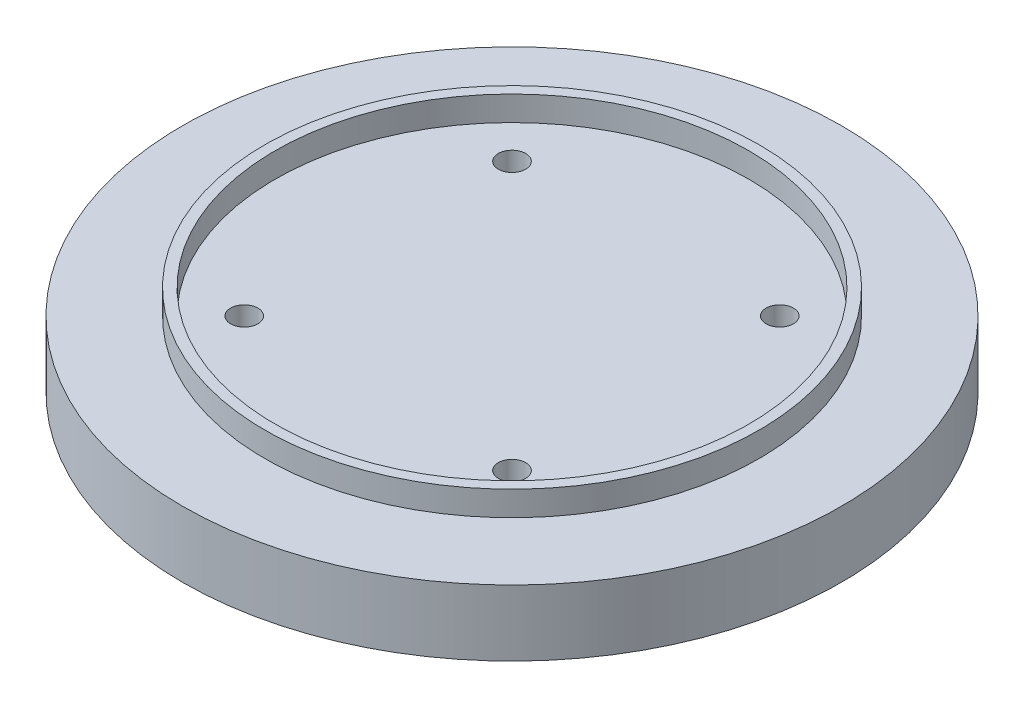
ISO-10303-21;
HEADER;
FILE_DESCRIPTION(('STEP AP214'),'2;1');
FILE_NAME('part.step','',(''),(''),'','','');
FILE_SCHEMA(('AUTOMOTIVE_DESIGN { 1 0 10303 214 1 1 1 1 }'));
ENDSEC;
DATA;
#1=APPLICATION_CONTEXT('core data for automotive mechanical design processes');
#2=APPLICATION_PROTOCOL_DEFINITION('international standard','automotive_design',2000,#1);
#3=PRODUCT_CONTEXT('',#1,'mechanical');
#4=PRODUCT('Part','Part','',(#3));
#5=PRODUCT_RELATED_PRODUCT_CATEGORY('part','',(#4));
#6=PRODUCT_DEFINITION_FORMATION('','',#4);
#7=PRODUCT_DEFINITION_CONTEXT('part definition',#1,'design');
#8=PRODUCT_DEFINITION('design','',#6,#7);
#9=PRODUCT_DEFINITION_SHAPE('','',#8);
#10=(LENGTH_UNIT() NAMED_UNIT(*) SI_UNIT(.MILLI.,.METRE.));
#11=(NAMED_UNIT(*) PLANE_ANGLE_UNIT() SI_UNIT($,.RADIAN.));
#12=(NAMED_UNIT(*) SI_UNIT($,.STERADIAN.) SOLID_ANGLE_UNIT());
#13=UNCERTAINTY_MEASURE_WITH_UNIT(LENGTH_MEASURE(1.E-05),#10,'distance_accuracy_value','');
#14=(GEOMETRIC_REPRESENTATION_CONTEXT(3) GLOBAL_UNCERTAINTY_ASSIGNED_CONTEXT((#13)) GLOBAL_UNIT_ASSIGNED_CONTEXT((#10,
#11,#12)) REPRESENTATION_CONTEXT('',''));
#15=CARTESIAN_POINT('',(0.,0.,0.));
#16=DIRECTION('',(0.,0.,1.));
#17=DIRECTION('',(1.,0.,0.));
#18=AXIS2_PLACEMENT_3D('',#15,#16,#17);
#19=CARTESIAN_POINT('',(0.,10.16,0.));
#20=DIRECTION('',(0.,1.,0.));
#21=DIRECTION('',(0.,0.,1.));
#22=AXIS2_PLACEMENT_3D('',#19,#20,#21);
#23=PLANE('',#22);
#24=CARTESIAN_POINT('',(0.,10.16,0.));
#25=DIRECTION('',(0.,1.,0.));
#26=DIRECTION('',(0.,0.,1.));
#27=AXIS2_PLACEMENT_3D('',#24,#25,#26);
#28=CIRCLE('',#27,101.6);
#29=CARTESIAN_POINT('',(0.,10.16,101.6));
#30=VERTEX_POINT('',#29);
#31=EDGE_CURVE('E49',#30,#30,#28,.T.);
#32=ORIENTED_EDGE('',*,*,#31,.T.);
#33=EDGE_LOOP('',(#32));
#34=FACE_BOUND('',#33,.T.);
#35=CARTESIAN_POINT('',(0.,10.16,0.));
#36=DIRECTION('',(0.,1.,0.));
#37=DIRECTION('',(0.,0.,1.));
#38=AXIS2_PLACEMENT_3D('',#35,#36,#37);
#39=CIRCLE('',#38,76.2);
#40=CARTESIAN_POINT('',(0.,10.16,-76.2));
#41=VERTEX_POINT('',#40);
#42=EDGE_CURVE('E461',#41,#41,#39,.T.);
#43=ORIENTED_EDGE('',*,*,#42,.F.);
#44=EDGE_LOOP('',(#43));
#45=FACE_BOUND('',#44,.T.);
#46=ADVANCED_FACE('F40',(#34,#45),#23,.T.);
#47=CARTESIAN_POINT('',(0.,10.16,0.));
#48=DIRECTION('',(0.,-1.,0.));
#49=DIRECTION('',(0.,0.,-1.));
#50=AXIS2_PLACEMENT_3D('',#47,#48,#49);
#51=CYLINDRICAL_SURFACE('',#50,101.6);
#52=ORIENTED_EDGE('',*,*,#31,.F.);
#53=EDGE_LOOP('',(#52));
#54=FACE_BOUND('',#53,.T.);
#55=CARTESIAN_POINT('',(0.,-10.16,0.));
#56=DIRECTION('',(0.,1.,0.));
#57=DIRECTION('',(0.,0.,1.));
#58=AXIS2_PLACEMENT_3D('',#55,#56,#57);
#59=CIRCLE('',#58,101.6);
#60=CARTESIAN_POINT('',(0.,-10.16,101.6));
#61=VERTEX_POINT('',#60);
#62=EDGE_CURVE('E149',#61,#61,#59,.T.);
#63=ORIENTED_EDGE('',*,*,#62,.T.);
#64=EDGE_LOOP('',(#63));
#65=FACE_BOUND('',#64,.T.);
#66=ADVANCED_FACE('F42',(#54,#65),#51,.T.);
#67=CARTESIAN_POINT('',(0.,-10.16,0.));
#68=DIRECTION('',(0.,1.,0.));
#69=DIRECTION('',(0.,0.,1.));
#70=AXIS2_PLACEMENT_3D('',#67,#68,#69);
#71=PLANE('',#70);
#72=CARTESIAN_POINT('',(-50.8,-10.16,50.8));
#73=DIRECTION('',(0.,-1.,0.));
#74=DIRECTION('',(0.,0.,-1.));
#75=AXIS2_PLACEMENT_3D('',#72,#73,#74);
#76=CIRCLE('',#75,4.2164);
#77=CARTESIAN_POINT('',(-50.8,-10.16,46.5836));
#78=VERTEX_POINT('',#77);
#79=EDGE_CURVE('E86',#78,#78,#76,.T.);
#80=ORIENTED_EDGE('',*,*,#79,.F.);
#81=EDGE_LOOP('',(#80));
#82=FACE_BOUND('',#81,.T.);
#83=CARTESIAN_POINT('',(50.8,-10.16,50.8));
#84=DIRECTION('',(0.,-1.,0.));
#85=DIRECTION('',(0.,0.,-1.));
#86=AXIS2_PLACEMENT_3D('',#83,#84,#85);
#87=CIRCLE('',#86,4.2164);
#88=CARTESIAN_POINT('',(50.8,-10.16,46.5836));
#89=VERTEX_POINT('',#88);
#90=EDGE_CURVE('E85',#89,#89,#87,.T.);
#91=ORIENTED_EDGE('',*,*,#90,.F.);
#92=EDGE_LOOP('',(#91));
#93=FACE_BOUND('',#92,.T.);
#94=CARTESIAN_POINT('',(50.8,-10.16,-50.8));
#95=DIRECTION('',(0.,-1.,0.));
#96=DIRECTION('',(0.,0.,-1.));
#97=AXIS2_PLACEMENT_3D('',#94,#95,#96);
#98=CIRCLE('',#97,4.2164);
#99=CARTESIAN_POINT('',(50.8,-10.16,-55.0164));
#100=VERTEX_POINT('',#99);
#101=EDGE_CURVE('E103',#100,#100,#98,.T.);
#102=ORIENTED_EDGE('',*,*,#101,.F.);
#103=EDGE_LOOP('',(#102));
#104=FACE_BOUND('',#103,.T.);
#105=CARTESIAN_POINT('',(-50.8,-10.16,-50.8));
#106=DIRECTION('',(0.,-1.,0.));
#107=DIRECTION('',(0.,0.,-1.));
#108=AXIS2_PLACEMENT_3D('',#105,#106,#107);
#109=CIRCLE('',#108,4.2164);
#110=CARTESIAN_POINT('',(-50.8,-10.16,-55.0164));
#111=VERTEX_POINT('',#110);
#112=EDGE_CURVE('E111',#111,#111,#109,.T.);
#113=ORIENTED_EDGE('',*,*,#112,.F.);
#114=EDGE_LOOP('',(#113));
#115=FACE_BOUND('',#114,.T.);
#116=ORIENTED_EDGE('',*,*,#62,.F.);
#117=EDGE_LOOP('',(#116));
#118=FACE_BOUND('',#117,.T.);
#119=ADVANCED_FACE('F157',(#82,#93,#104,#115,#118),#71,.F.);
#120=CARTESIAN_POINT('',(-50.8,4.064,-50.8));
#121=DIRECTION('',(0.,-1.,0.));
#122=DIRECTION('',(0.,0.,-1.));
#123=AXIS2_PLACEMENT_3D('',#120,#121,#122);
#124=CONICAL_SURFACE('',#123,4.21639999999999,1.02974425867665);
#125=CARTESIAN_POINT('',(-50.8,6.59746871406781,-50.8));
#126=VERTEX_POINT('',#125);
#127=VERTEX_LOOP('',#126);
#128=FACE_BOUND('',#127,.T.);
#129=CARTESIAN_POINT('',(-50.8,4.064,-50.8));
#130=DIRECTION('',(0.,-1.,0.));
#131=DIRECTION('',(0.,0.,-1.));
#132=AXIS2_PLACEMENT_3D('',#129,#130,#131);
#133=CIRCLE('',#132,4.21639999999999);
#134=CARTESIAN_POINT('',(-50.8,4.064,-55.0164));
#135=VERTEX_POINT('',#134);
#136=EDGE_CURVE('E115',#135,#135,#133,.T.);
#137=ORIENTED_EDGE('',*,*,#136,.T.);
#138=EDGE_LOOP('',(#137));
#139=FACE_BOUND('',#138,.T.);
#140=ADVANCED_FACE('F159',(#128,#139),#124,.F.);
#141=CARTESIAN_POINT('',(-50.8,-10.16,-50.8));
#142=DIRECTION('',(0.,-1.,0.));
#143=DIRECTION('',(0.,0.,-1.));
#144=AXIS2_PLACEMENT_3D('',#141,#142,#143);
#145=CYLINDRICAL_SURFACE('',#144,4.2164);
#146=ORIENTED_EDGE('',*,*,#136,.F.);
#147=EDGE_LOOP('',(#146));
#148=FACE_BOUND('',#147,.T.);
#149=ORIENTED_EDGE('',*,*,#112,.T.);
#150=EDGE_LOOP('',(#149));
#151=FACE_BOUND('',#150,.T.);
#152=ADVANCED_FACE('F165',(#148,#151),#145,.F.);
#153=CARTESIAN_POINT('',(50.8,4.064,-50.8));
#154=DIRECTION('',(0.,-1.,0.));
#155=DIRECTION('',(0.,0.,-1.));
#156=AXIS2_PLACEMENT_3D('',#153,#154,#155);
#157=CONICAL_SURFACE('',#156,4.21639999999999,1.02974425867665);
#158=CARTESIAN_POINT('',(50.8,6.59746871406781,-50.8));
#159=VERTEX_POINT('',#158);
#160=VERTEX_LOOP('',#159);
#161=FACE_BOUND('',#160,.T.);
#162=CARTESIAN_POINT('',(50.8,4.064,-50.8));
#163=DIRECTION('',(0.,-1.,0.));
#164=DIRECTION('',(0.,0.,-1.));
#165=AXIS2_PLACEMENT_3D('',#162,#163,#164);
#166=CIRCLE('',#165,4.21639999999999);
#167=CARTESIAN_POINT('',(50.8,4.064,-55.0164));
#168=VERTEX_POINT('',#167);
#169=EDGE_CURVE('E107',#168,#168,#166,.T.);
#170=ORIENTED_EDGE('',*,*,#169,.T.);
#171=EDGE_LOOP('',(#170));
#172=FACE_BOUND('',#171,.T.);
#173=ADVANCED_FACE('F251',(#161,#172),#157,.F.);
#174=CARTESIAN_POINT('',(50.8,-10.16,-50.8));
#175=DIRECTION('',(0.,-1.,0.));
#176=DIRECTION('',(0.,0.,-1.));
#177=AXIS2_PLACEMENT_3D('',#174,#175,#176);
#178=CYLINDRICAL_SURFACE('',#177,4.2164);
#179=ORIENTED_EDGE('',*,*,#169,.F.);
#180=EDGE_LOOP('',(#179));
#181=FACE_BOUND('',#180,.T.);
#182=ORIENTED_EDGE('',*,*,#101,.T.);
#183=EDGE_LOOP('',(#182));
#184=FACE_BOUND('',#183,.T.);
#185=ADVANCED_FACE('F247',(#181,#184),#178,.F.);
#186=CARTESIAN_POINT('',(50.8,4.064,50.8));
#187=DIRECTION('',(0.,-1.,0.));
#188=DIRECTION('',(0.,0.,-1.));
#189=AXIS2_PLACEMENT_3D('',#186,#187,#188);
#190=CONICAL_SURFACE('',#189,4.21639999999999,1.02974425867665);
#191=CARTESIAN_POINT('',(50.8,6.59746871406781,50.8));
#192=VERTEX_POINT('',#191);
#193=VERTEX_LOOP('',#192);
#194=FACE_BOUND('',#193,.T.);
#195=CARTESIAN_POINT('',(50.8,4.064,50.8));
#196=DIRECTION('',(0.,-1.,0.));
#197=DIRECTION('',(0.,0.,-1.));
#198=AXIS2_PLACEMENT_3D('',#195,#196,#197);
#199=CIRCLE('',#198,4.21639999999999);
#200=CARTESIAN_POINT('',(50.8,4.064,46.5836));
#201=VERTEX_POINT('',#200);
#202=EDGE_CURVE('E92',#201,#201,#199,.T.);
#203=ORIENTED_EDGE('',*,*,#202,.T.);
#204=EDGE_LOOP('',(#203));
#205=FACE_BOUND('',#204,.T.);
#206=ADVANCED_FACE('F243',(#194,#205),#190,.F.);
#207=CARTESIAN_POINT('',(50.8,-10.16,50.8));
#208=DIRECTION('',(0.,-1.,0.));
#209=DIRECTION('',(0.,0.,-1.));
#210=AXIS2_PLACEMENT_3D('',#207,#208,#209);
#211=CYLINDRICAL_SURFACE('',#210,4.2164);
#212=ORIENTED_EDGE('',*,*,#202,.F.);
#213=EDGE_LOOP('',(#212));
#214=FACE_BOUND('',#213,.T.);
#215=ORIENTED_EDGE('',*,*,#90,.T.);
#216=EDGE_LOOP('',(#215));
#217=FACE_BOUND('',#216,.T.);
#218=ADVANCED_FACE('F78',(#214,#217),#211,.F.);
#219=CARTESIAN_POINT('',(-50.8,4.064,50.8));
#220=DIRECTION('',(0.,-1.,0.));
#221=DIRECTION('',(0.,0.,-1.));
#222=AXIS2_PLACEMENT_3D('',#219,#220,#221);
#223=CONICAL_SURFACE('',#222,4.21639999999999,1.02974425867665);
#224=CARTESIAN_POINT('',(-50.8,6.59746871406781,50.8));
#225=VERTEX_POINT('',#224);
#226=VERTEX_LOOP('',#225);
#227=FACE_BOUND('',#226,.T.);
#228=CARTESIAN_POINT('',(-50.8,4.064,50.8));
#229=DIRECTION('',(0.,-1.,0.));
#230=DIRECTION('',(0.,0.,-1.));
#231=AXIS2_PLACEMENT_3D('',#228,#229,#230);
#232=CIRCLE('',#231,4.21639999999999);
#233=CARTESIAN_POINT('',(-50.8,4.064,46.5836));
#234=VERTEX_POINT('',#233);
#235=EDGE_CURVE('E82',#234,#234,#232,.T.);
#236=ORIENTED_EDGE('',*,*,#235,.T.);
#237=EDGE_LOOP('',(#236));
#238=FACE_BOUND('',#237,.T.);
#239=ADVANCED_FACE('F74',(#227,#238),#223,.F.);
#240=CARTESIAN_POINT('',(-50.8,-10.16,50.8));
#241=DIRECTION('',(0.,-1.,0.));
#242=DIRECTION('',(0.,0.,-1.));
#243=AXIS2_PLACEMENT_3D('',#240,#241,#242);
#244=CYLINDRICAL_SURFACE('',#243,4.2164);
#245=ORIENTED_EDGE('',*,*,#235,.F.);
#246=EDGE_LOOP('',(#245));
#247=FACE_BOUND('',#246,.T.);
#248=ORIENTED_EDGE('',*,*,#79,.T.);
#249=EDGE_LOOP('',(#248));
#250=FACE_BOUND('',#249,.T.);
#251=ADVANCED_FACE('F77',(#247,#250),#244,.F.);
#252=CARTESIAN_POINT('',(0.,17.78,0.));
#253=DIRECTION('',(0.,1.,0.));
#254=DIRECTION('',(0.,0.,1.));
#255=AXIS2_PLACEMENT_3D('',#252,#253,#254);
#256=PLANE('',#255);
#257=CARTESIAN_POINT('',(0.,17.78,0.));
#258=DIRECTION('',(0.,1.,0.));
#259=DIRECTION('',(0.,0.,1.));
#260=AXIS2_PLACEMENT_3D('',#257,#258,#259);
#261=CIRCLE('',#260,76.2);
#262=CARTESIAN_POINT('',(0.,17.78,-76.2));
#263=VERTEX_POINT('',#262);
#264=EDGE_CURVE('E96',#263,#263,#261,.T.);
#265=ORIENTED_EDGE('',*,*,#264,.T.);
#266=EDGE_LOOP('',(#265));
#267=FACE_BOUND('',#266,.T.);
#268=CARTESIAN_POINT('',(0.,17.78,0.));
#269=DIRECTION('',(0.,1.,0.));
#270=DIRECTION('',(0.,0.,1.));
#271=AXIS2_PLACEMENT_3D('',#268,#269,#270);
#272=CIRCLE('',#271,73.025);
#273=CARTESIAN_POINT('',(0.,17.78,-73.025));
#274=VERTEX_POINT('',#273);
#275=EDGE_CURVE('E459',#274,#274,#272,.T.);
#276=ORIENTED_EDGE('',*,*,#275,.F.);
#277=EDGE_LOOP('',(#276));
#278=FACE_BOUND('',#277,.T.);
#279=ADVANCED_FACE('F230',(#267,#278),#256,.T.);
#280=CARTESIAN_POINT('',(0.,17.78,0.));
#281=DIRECTION('',(0.,-1.,0.));
#282=DIRECTION('',(0.,0.,-1.));
#283=AXIS2_PLACEMENT_3D('',#280,#281,#282);
#284=CYLINDRICAL_SURFACE('',#283,76.2);
#285=CARTESIAN_POINT('',(0.,17.78,-76.2));
#286=CARTESIAN_POINT('',(0.,17.700625,-76.2));
#287=CARTESIAN_POINT('',(0.,17.62125,-76.2));
#288=CARTESIAN_POINT('',(0.,17.4625,-76.2));
#289=CARTESIAN_POINT('',(0.,17.383125,-76.2));
#290=CARTESIAN_POINT('',(0.,17.224375,-76.2));
#291=CARTESIAN_POINT('',(0.,17.145,-76.2));
#292=CARTESIAN_POINT('',(0.,16.98625,-76.2));
#293=CARTESIAN_POINT('',(0.,16.906875,-76.2));
#294=CARTESIAN_POINT('',(0.,16.748125,-76.2));
#295=CARTESIAN_POINT('',(0.,16.66875,-76.2));
#296=CARTESIAN_POINT('',(0.,16.51,-76.2));
#297=CARTESIAN_POINT('',(0.,16.430625,-76.2));
#298=CARTESIAN_POINT('',(0.,16.271875,-76.2));
#299=CARTESIAN_POINT('',(0.,16.1925,-76.2));
#300=CARTESIAN_POINT('',(0.,16.03375,-76.2));
#301=CARTESIAN_POINT('',(0.,15.954375,-76.2));
#302=CARTESIAN_POINT('',(0.,15.795625,-76.2));
#303=CARTESIAN_POINT('',(0.,15.71625,-76.2));
#304=CARTESIAN_POINT('',(0.,15.5575,-76.2));
#305=CARTESIAN_POINT('',(0.,15.478125,-76.2));
#306=CARTESIAN_POINT('',(0.,15.319375,-76.2));
#307=CARTESIAN_POINT('',(0.,15.24,-76.2));
#308=CARTESIAN_POINT('',(0.,15.08125,-76.2));
#309=CARTESIAN_POINT('',(0.,15.001875,-76.2));
#310=CARTESIAN_POINT('',(0.,14.843125,-76.2));
#311=CARTESIAN_POINT('',(0.,14.76375,-76.2));
#312=CARTESIAN_POINT('',(0.,14.605,-76.2));
#313=CARTESIAN_POINT('',(0.,14.525625,-76.2));
#314=CARTESIAN_POINT('',(0.,14.366875,-76.2));
#315=CARTESIAN_POINT('',(0.,14.2875,-76.2));
#316=CARTESIAN_POINT('',(0.,14.12875,-76.2));
#317=CARTESIAN_POINT('',(0.,14.049375,-76.2));
#318=CARTESIAN_POINT('',(0.,13.890625,-76.2));
#319=CARTESIAN_POINT('',(0.,13.81125,-76.2));
#320=CARTESIAN_POINT('',(0.,13.6525,-76.2));
#321=CARTESIAN_POINT('',(0.,13.573125,-76.2));
#322=CARTESIAN_POINT('',(0.,13.414375,-76.2));
#323=CARTESIAN_POINT('',(0.,13.335,-76.2));
#324=CARTESIAN_POINT('',(0.,13.17625,-76.2));
#325=CARTESIAN_POINT('',(0.,13.096875,-76.2));
#326=CARTESIAN_POINT('',(0.,12.938125,-76.2));
#327=CARTESIAN_POINT('',(0.,12.85875,-76.2));
#328=CARTESIAN_POINT('',(0.,12.7,-76.2));
#329=CARTESIAN_POINT('',(0.,12.620625,-76.2));
#330=CARTESIAN_POINT('',(0.,12.461875,-76.2));
#331=CARTESIAN_POINT('',(0.,12.3825,-76.2));
#332=CARTESIAN_POINT('',(0.,12.22375,-76.2));
#333=CARTESIAN_POINT('',(0.,12.144375,-76.2));
#334=CARTESIAN_POINT('',(0.,11.985625,-76.2));
#335=CARTESIAN_POINT('',(0.,11.90625,-76.2));
#336=CARTESIAN_POINT('',(0.,11.7475,-76.2));
#337=CARTESIAN_POINT('',(0.,11.668125,-76.2));
#338=CARTESIAN_POINT('',(0.,11.509375,-76.2));
#339=CARTESIAN_POINT('',(0.,11.43,-76.2));
#340=CARTESIAN_POINT('',(0.,11.27125,-76.2));
#341=CARTESIAN_POINT('',(0.,11.191875,-76.2));
#342=CARTESIAN_POINT('',(0.,11.033125,-76.2));
#343=CARTESIAN_POINT('',(0.,10.95375,-76.2));
#344=CARTESIAN_POINT('',(0.,10.795,-76.2));
#345=CARTESIAN_POINT('',(0.,10.715625,-76.2));
#346=CARTESIAN_POINT('',(0.,10.556875,-76.2));
#347=CARTESIAN_POINT('',(0.,10.4775,-76.2));
#348=CARTESIAN_POINT('',(0.,10.31875,-76.2));
#349=CARTESIAN_POINT('',(0.,10.239375,-76.2));
#350=CARTESIAN_POINT('',(0.,10.16,-76.2));
#351=B_SPLINE_CURVE_WITH_KNOTS('',3,(#285,#286,#287,#288,#289,#290,#291,#292,#293,#294,#295,
#296,#297,#298,#299,#300,#301,#302,#303,#304,#305,#306,#307,#308,#309,#310,#311,#312,#313,#314,
#315,#316,#317,#318,#319,#320,#321,#322,#323,#324,#325,#326,#327,#328,#329,#330,#331,#332,#333,
#334,#335,#336,#337,#338,#339,#340,#341,#342,#343,#344,#345,#346,#347,#348,#349,#350),
.UNSPECIFIED.,.F.,.F.,(4,2,2,2,2,2,2,2,2,2,2,2,2,2,2,2,2,2,2,2,2,2,2,2,2,2,2,2,2,2,2,2,4),(0.,
0.238125000000002,0.476250000000001,0.714375000000003,0.952500000000002,1.190625,1.42875,
1.666875,1.905,2.143125,2.38125,2.619375,2.8575,3.095625,3.33375,3.571875,3.81,4.048125,4.28625,
4.524375,4.7625,5.000625,5.23875,5.476875,5.715,5.953125,6.19125,6.429375,6.6675,6.905625,
7.14375,7.381875,7.62),.UNSPECIFIED.);
#352=EDGE_CURVE('BSEAM223',#263,#41,#351,.T.);
#353=ORIENTED_EDGE('',*,*,#264,.F.);
#354=ORIENTED_EDGE('',*,*,#42,.T.);
#355=ORIENTED_EDGE('',*,*,#352,.T.);
#356=ORIENTED_EDGE('',*,*,#352,.F.);
#357=EDGE_LOOP('',(#353,#355,#354,#356));
#358=FACE_BOUND('',#357,.T.);
#359=ADVANCED_FACE('F223',(#358),#284,.T.);
#360=CARTESIAN_POINT('',(0.,17.78,0.));
#361=DIRECTION('',(0.,-1.,0.));
#362=DIRECTION('',(0.,0.,-1.));
#363=AXIS2_PLACEMENT_3D('',#360,#361,#362);
#364=CYLINDRICAL_SURFACE('',#363,73.025);
#365=CARTESIAN_POINT('',(0.,10.16,0.));
#366=DIRECTION('',(0.,1.,0.));
#367=DIRECTION('',(0.,0.,1.));
#368=AXIS2_PLACEMENT_3D('',#365,#366,#367);
#369=CIRCLE('',#368,73.025);
#370=CARTESIAN_POINT('',(0.,10.16,-73.025));
#371=VERTEX_POINT('',#370);
#372=EDGE_CURVE('E11',#371,#371,#369,.F.);
#373=CARTESIAN_POINT('',(0.,17.78,-73.025));
#374=CARTESIAN_POINT('',(0.,17.700625,-73.025));
#375=CARTESIAN_POINT('',(0.,17.62125,-73.025));
#376=CARTESIAN_POINT('',(0.,17.4625,-73.025));
#377=CARTESIAN_POINT('',(0.,17.383125,-73.025));
#378=CARTESIAN_POINT('',(0.,17.224375,-73.025));
#379=CARTESIAN_POINT('',(0.,17.145,-73.025));
#380=CARTESIAN_POINT('',(0.,16.98625,-73.025));
#381=CARTESIAN_POINT('',(0.,16.906875,-73.025));
#382=CARTESIAN_POINT('',(0.,16.748125,-73.025));
#383=CARTESIAN_POINT('',(0.,16.66875,-73.025));
#384=CARTESIAN_POINT('',(0.,16.51,-73.025));
#385=CARTESIAN_POINT('',(0.,16.430625,-73.025));
#386=CARTESIAN_POINT('',(0.,16.271875,-73.025));
#387=CARTESIAN_POINT('',(0.,16.1925,-73.025));
#388=CARTESIAN_POINT('',(0.,16.03375,-73.025));
#389=CARTESIAN_POINT('',(0.,15.954375,-73.025));
#390=CARTESIAN_POINT('',(0.,15.795625,-73.025));
#391=CARTESIAN_POINT('',(0.,15.71625,-73.025));
#392=CARTESIAN_POINT('',(0.,15.5575,-73.025));
#393=CARTESIAN_POINT('',(0.,15.478125,-73.025));
#394=CARTESIAN_POINT('',(0.,15.319375,-73.025));
#395=CARTESIAN_POINT('',(0.,15.24,-73.025));
#396=CARTESIAN_POINT('',(0.,15.08125,-73.025));
#397=CARTESIAN_POINT('',(0.,15.001875,-73.025));
#398=CARTESIAN_POINT('',(0.,14.843125,-73.025));
#399=CARTESIAN_POINT('',(0.,14.76375,-73.025));
#400=CARTESIAN_POINT('',(0.,14.605,-73.025));
#401=CARTESIAN_POINT('',(0.,14.525625,-73.025));
#402=CARTESIAN_POINT('',(0.,14.366875,-73.025));
#403=CARTESIAN_POINT('',(0.,14.2875,-73.025));
#404=CARTESIAN_POINT('',(0.,14.12875,-73.025));
#405=CARTESIAN_POINT('',(0.,14.049375,-73.025));
#406=CARTESIAN_POINT('',(0.,13.890625,-73.025));
#407=CARTESIAN_POINT('',(0.,13.81125,-73.025));
#408=CARTESIAN_POINT('',(0.,13.6525,-73.025));
#409=CARTESIAN_POINT('',(0.,13.573125,-73.025));
#410=CARTESIAN_POINT('',(0.,13.414375,-73.025));
#411=CARTESIAN_POINT('',(0.,13.335,-73.025));
#412=CARTESIAN_POINT('',(0.,13.17625,-73.025));
#413=CARTESIAN_POINT('',(0.,13.096875,-73.025));
#414=CARTESIAN_POINT('',(0.,12.938125,-73.025));
#415=CARTESIAN_POINT('',(0.,12.85875,-73.025));
#416=CARTESIAN_POINT('',(0.,12.7,-73.025));
#417=CARTESIAN_POINT('',(0.,12.620625,-73.025));
#418=CARTESIAN_POINT('',(0.,12.461875,-73.025));
#419=CARTESIAN_POINT('',(0.,12.3825,-73.025));
#420=CARTESIAN_POINT('',(0.,12.22375,-73.025));
#421=CARTESIAN_POINT('',(0.,12.144375,-73.025));
#422=CARTESIAN_POINT('',(0.,11.985625,-73.025));
#423=CARTESIAN_POINT('',(0.,11.90625,-73.025));
#424=CARTESIAN_POINT('',(0.,11.7475,-73.025));
#425=CARTESIAN_POINT('',(0.,11.668125,-73.025));
#426=CARTESIAN_POINT('',(0.,11.509375,-73.025));
#427=CARTESIAN_POINT('',(0.,11.43,-73.025));
#428=CARTESIAN_POINT('',(0.,11.27125,-73.025));
#429=CARTESIAN_POINT('',(0.,11.191875,-73.025));
#430=CARTESIAN_POINT('',(0.,11.033125,-73.025));
#431=CARTESIAN_POINT('',(0.,10.95375,-73.025));
#432=CARTESIAN_POINT('',(0.,10.795,-73.025));
#433=CARTESIAN_POINT('',(0.,10.715625,-73.025));
#434=CARTESIAN_POINT('',(0.,10.556875,-73.025));
#435=CARTESIAN_POINT('',(0.,10.4775,-73.025));
#436=CARTESIAN_POINT('',(0.,10.31875,-73.025));
#437=CARTESIAN_POINT('',(0.,10.239375,-73.025));
#438=CARTESIAN_POINT('',(0.,10.16,-73.025));
#439=B_SPLINE_CURVE_WITH_KNOTS('',3,(#373,#374,#375,#376,#377,#378,#379,#380,#381,#382,#383,
#384,#385,#386,#387,#388,#389,#390,#391,#392,#393,#394,#395,#396,#397,#398,#399,#400,#401,#402,
#403,#404,#405,#406,#407,#408,#409,#410,#411,#412,#413,#414,#415,#416,#417,#418,#419,#420,#421,
#422,#423,#424,#425,#426,#427,#428,#429,#430,#431,#432,#433,#434,#435,#436,#437,#438),
.UNSPECIFIED.,.F.,.F.,(4,2,2,2,2,2,2,2,2,2,2,2,2,2,2,2,2,2,2,2,2,2,2,2,2,2,2,2,2,2,2,2,4),(0.,
0.238124999999999,0.476249999999998,0.714375,0.952499999999998,1.190625,1.42875,1.666875,1.905,
2.143125,2.38125,2.619375,2.8575,3.095625,3.33375,3.571875,3.81,4.048125,4.28625,4.524375,
4.7625,5.000625,5.23875,5.476875,5.715,5.953125,6.19125,6.429375,6.6675,6.905625,7.14375,
7.381875,7.62),.UNSPECIFIED.);
#440=EDGE_CURVE('BSEAM218',#274,#371,#439,.T.);
#441=ORIENTED_EDGE('',*,*,#275,.T.);
#442=ORIENTED_EDGE('',*,*,#372,.T.);
#443=ORIENTED_EDGE('',*,*,#440,.T.);
#444=ORIENTED_EDGE('',*,*,#440,.F.);
#445=EDGE_LOOP('',(#441,#443,#442,#444));
#446=FACE_BOUND('',#445,.T.);
#447=ADVANCED_FACE('F218',(#446),#364,.F.);
#448=CARTESIAN_POINT('',(-41.275,-3.302,41.275));
#449=DIRECTION('',(0.,1.,0.));
#450=DIRECTION('',(0.,0.,1.));
#451=AXIS2_PLACEMENT_3D('',#448,#449,#450);
#452=CONICAL_SURFACE('',#451,4.21639999999999,1.02974425867665);
#453=CARTESIAN_POINT('',(-41.275,-5.83546871406781,41.275));
#454=VERTEX_POINT('',#453);
#455=VERTEX_LOOP('',#454);
#456=FACE_BOUND('',#455,.T.);
#457=CARTESIAN_POINT('',(-41.275,-3.302,41.275));
#458=DIRECTION('',(0.,1.,0.));
#459=DIRECTION('',(0.,0.,1.));
#460=AXIS2_PLACEMENT_3D('',#457,#458,#459);
#461=CIRCLE('',#460,4.21639999999999);
#462=CARTESIAN_POINT('',(-41.275,-3.302,45.4914));
#463=VERTEX_POINT('',#462);
#464=EDGE_CURVE('E145',#463,#463,#461,.T.);
#465=ORIENTED_EDGE('',*,*,#464,.T.);
#466=EDGE_LOOP('',(#465));
#467=FACE_BOUND('',#466,.T.);
#468=ADVANCED_FACE('F216',(#456,#467),#452,.F.);
#469=CARTESIAN_POINT('',(41.275,-3.302,41.275));
#470=DIRECTION('',(0.,1.,0.));
#471=DIRECTION('',(0.,0.,1.));
#472=AXIS2_PLACEMENT_3D('',#469,#470,#471);
#473=CONICAL_SURFACE('',#472,4.21639999999999,1.02974425867665);
#474=CARTESIAN_POINT('',(41.275,-5.83546871406781,41.275));
#475=VERTEX_POINT('',#474);
#476=VERTEX_LOOP('',#475);
#477=FACE_BOUND('',#476,.T.);
#478=CARTESIAN_POINT('',(41.275,-3.302,41.275));
#479=DIRECTION('',(0.,1.,0.));
#480=DIRECTION('',(0.,0.,1.));
#481=AXIS2_PLACEMENT_3D('',#478,#479,#480);
#482=CIRCLE('',#481,4.21639999999999);
#483=CARTESIAN_POINT('',(41.275,-3.302,45.4914));
#484=VERTEX_POINT('',#483);
#485=EDGE_CURVE('E137',#484,#484,#482,.T.);
#486=ORIENTED_EDGE('',*,*,#485,.T.);
#487=EDGE_LOOP('',(#486));
#488=FACE_BOUND('',#487,.T.);
#489=ADVANCED_FACE('F215',(#477,#488),#473,.F.);
#490=CARTESIAN_POINT('',(41.275,-3.302,-41.275));
#491=DIRECTION('',(0.,1.,0.));
#492=DIRECTION('',(0.,0.,1.));
#493=AXIS2_PLACEMENT_3D('',#490,#491,#492);
#494=CONICAL_SURFACE('',#493,4.21639999999999,1.02974425867665);
#495=CARTESIAN_POINT('',(41.275,-5.83546871406781,-41.275));
#496=VERTEX_POINT('',#495);
#497=VERTEX_LOOP('',#496);
#498=FACE_BOUND('',#497,.T.);
#499=CARTESIAN_POINT('',(41.275,-3.302,-41.275));
#500=DIRECTION('',(0.,1.,0.));
#501=DIRECTION('',(0.,0.,1.));
#502=AXIS2_PLACEMENT_3D('',#499,#500,#501);
#503=CIRCLE('',#502,4.21639999999999);
#504=CARTESIAN_POINT('',(41.275,-3.302,-37.0586));
#505=VERTEX_POINT('',#504);
#506=EDGE_CURVE('E130',#505,#505,#503,.T.);
#507=ORIENTED_EDGE('',*,*,#506,.T.);
#508=EDGE_LOOP('',(#507));
#509=FACE_BOUND('',#508,.T.);
#510=ADVANCED_FACE('F210',(#498,#509),#494,.F.);
#511=CARTESIAN_POINT('',(-41.275,-3.302,-41.275));
#512=DIRECTION('',(0.,1.,0.));
#513=DIRECTION('',(0.,0.,1.));
#514=AXIS2_PLACEMENT_3D('',#511,#512,#513);
#515=CONICAL_SURFACE('',#514,4.21639999999999,1.02974425867665);
#516=CARTESIAN_POINT('',(-41.275,-5.83546871406781,-41.275));
#517=VERTEX_POINT('',#516);
#518=VERTEX_LOOP('',#517);
#519=FACE_BOUND('',#518,.T.);
#520=CARTESIAN_POINT('',(-41.275,-3.302,-41.275));
#521=DIRECTION('',(0.,1.,0.));
#522=DIRECTION('',(0.,0.,1.));
#523=AXIS2_PLACEMENT_3D('',#520,#521,#522);
#524=CIRCLE('',#523,4.21639999999999);
#525=CARTESIAN_POINT('',(-41.275,-3.302,-37.0586));
#526=VERTEX_POINT('',#525);
#527=EDGE_CURVE('E123',#526,#526,#524,.T.);
#528=ORIENTED_EDGE('',*,*,#527,.T.);
#529=EDGE_LOOP('',(#528));
#530=FACE_BOUND('',#529,.T.);
#531=ADVANCED_FACE('F201',(#519,#530),#515,.F.);
#532=CARTESIAN_POINT('',(-41.275,10.16,41.275));
#533=DIRECTION('',(0.,1.,0.));
#534=DIRECTION('',(0.,0.,1.));
#535=AXIS2_PLACEMENT_3D('',#532,#533,#534);
#536=CYLINDRICAL_SURFACE('',#535,4.21639999999999);
#537=ORIENTED_EDGE('',*,*,#464,.F.);
#538=EDGE_LOOP('',(#537));
#539=FACE_BOUND('',#538,.T.);
#540=CARTESIAN_POINT('',(-41.275,10.16,41.275));
#541=DIRECTION('',(0.,1.,0.));
#542=DIRECTION('',(0.,0.,1.));
#543=AXIS2_PLACEMENT_3D('',#540,#541,#542);
#544=CIRCLE('',#543,4.21639999999999);
#545=CARTESIAN_POINT('',(-41.275,10.16,45.4914));
#546=VERTEX_POINT('',#545);
#547=EDGE_CURVE('E141',#546,#546,#544,.T.);
#548=ORIENTED_EDGE('',*,*,#547,.T.);
#549=EDGE_LOOP('',(#548));
#550=FACE_BOUND('',#549,.T.);
#551=ADVANCED_FACE('F198',(#539,#550),#536,.F.);
#552=CARTESIAN_POINT('',(41.275,10.16,41.275));
#553=DIRECTION('',(0.,1.,0.));
#554=DIRECTION('',(0.,0.,1.));
#555=AXIS2_PLACEMENT_3D('',#552,#553,#554);
#556=CYLINDRICAL_SURFACE('',#555,4.21639999999999);
#557=ORIENTED_EDGE('',*,*,#485,.F.);
#558=EDGE_LOOP('',(#557));
#559=FACE_BOUND('',#558,.T.);
#560=CARTESIAN_POINT('',(41.275,10.16,41.275));
#561=DIRECTION('',(0.,1.,0.));
#562=DIRECTION('',(0.,0.,1.));
#563=AXIS2_PLACEMENT_3D('',#560,#561,#562);
#564=CIRCLE('',#563,4.21639999999999);
#565=CARTESIAN_POINT('',(41.275,10.16,45.4914));
#566=VERTEX_POINT('',#565);
#567=EDGE_CURVE('E133',#566,#566,#564,.T.);
#568=ORIENTED_EDGE('',*,*,#567,.T.);
#569=EDGE_LOOP('',(#568));
#570=FACE_BOUND('',#569,.T.);
#571=ADVANCED_FACE('F200',(#559,#570),#556,.F.);
#572=CARTESIAN_POINT('',(41.275,10.16,-41.275));
#573=DIRECTION('',(0.,1.,0.));
#574=DIRECTION('',(0.,0.,1.));
#575=AXIS2_PLACEMENT_3D('',#572,#573,#574);
#576=CYLINDRICAL_SURFACE('',#575,4.21639999999999);
#577=ORIENTED_EDGE('',*,*,#506,.F.);
#578=EDGE_LOOP('',(#577));
#579=FACE_BOUND('',#578,.T.);
#580=CARTESIAN_POINT('',(41.275,10.16,-41.275));
#581=DIRECTION('',(0.,1.,0.));
#582=DIRECTION('',(0.,0.,1.));
#583=AXIS2_PLACEMENT_3D('',#580,#581,#582);
#584=CIRCLE('',#583,4.21639999999999);
#585=CARTESIAN_POINT('',(41.275,10.16,-37.0586));
#586=VERTEX_POINT('',#585);
#587=EDGE_CURVE('E126',#586,#586,#584,.T.);
#588=ORIENTED_EDGE('',*,*,#587,.T.);
#589=EDGE_LOOP('',(#588));
#590=FACE_BOUND('',#589,.T.);
#591=ADVANCED_FACE('F185',(#579,#590),#576,.F.);
#592=CARTESIAN_POINT('',(-41.275,10.16,-41.275));
#593=DIRECTION('',(0.,1.,0.));
#594=DIRECTION('',(0.,0.,1.));
#595=AXIS2_PLACEMENT_3D('',#592,#593,#594);
#596=CYLINDRICAL_SURFACE('',#595,4.21639999999999);
#597=ORIENTED_EDGE('',*,*,#527,.F.);
#598=EDGE_LOOP('',(#597));
#599=FACE_BOUND('',#598,.T.);
#600=CARTESIAN_POINT('',(-41.275,10.16,-41.275));
#601=DIRECTION('',(0.,1.,0.));
#602=DIRECTION('',(0.,0.,1.));
#603=AXIS2_PLACEMENT_3D('',#600,#601,#602);
#604=CIRCLE('',#603,4.21639999999999);
#605=CARTESIAN_POINT('',(-41.275,10.16,-37.0586));
#606=VERTEX_POINT('',#605);
#607=EDGE_CURVE('E119',#606,#606,#604,.T.);
#608=ORIENTED_EDGE('',*,*,#607,.T.);
#609=EDGE_LOOP('',(#608));
#610=FACE_BOUND('',#609,.T.);
#611=ADVANCED_FACE('F180',(#599,#610),#596,.F.);
#612=ORIENTED_EDGE('',*,*,#372,.F.);
#613=EDGE_LOOP('',(#612));
#614=FACE_BOUND('',#613,.T.);
#615=ORIENTED_EDGE('',*,*,#607,.F.);
#616=EDGE_LOOP('',(#615));
#617=FACE_BOUND('',#616,.T.);
#618=ORIENTED_EDGE('',*,*,#587,.F.);
#619=EDGE_LOOP('',(#618));
#620=FACE_BOUND('',#619,.T.);
#621=ORIENTED_EDGE('',*,*,#567,.F.);
#622=EDGE_LOOP('',(#621));
#623=FACE_BOUND('',#622,.T.);
#624=ORIENTED_EDGE('',*,*,#547,.F.);
#625=EDGE_LOOP('',(#624));
#626=FACE_BOUND('',#625,.T.);
#627=ADVANCED_FACE('F174',(#614,#617,#620,#623,#626),#23,.T.);
#628=CLOSED_SHELL('',(#46,#66,#119,#140,#152,#173,#185,#206,#218,#239,#251,#279,#359,#447,#468,
#489,#510,#531,#551,#571,#591,#611,#627));
#629=MANIFOLD_SOLID_BREP('B2',#628);
#630=ADVANCED_BREP_SHAPE_REPRESENTATION('',(#18,#629),#14);
#631=SHAPE_DEFINITION_REPRESENTATION(#9,#630);
ENDSEC;
END-ISO-10303-21;
